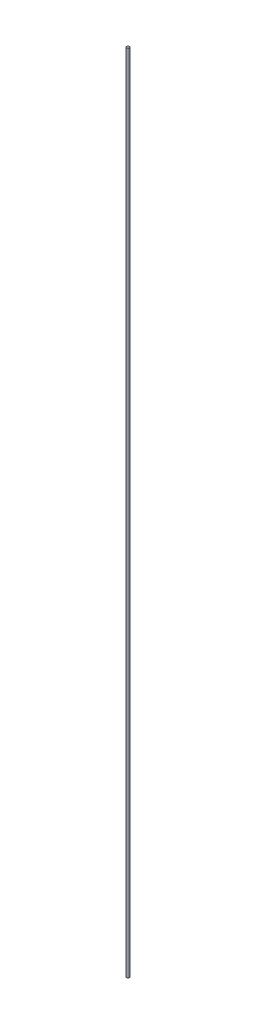
ISO-10303-21;
HEADER;
FILE_DESCRIPTION(('STEP AP214'),'2;1');
FILE_NAME('part.step','',(''),(''),'','','');
FILE_SCHEMA(('AUTOMOTIVE_DESIGN { 1 0 10303 214 1 1 1 1 }'));
ENDSEC;
DATA;
#1=APPLICATION_CONTEXT('core data for automotive mechanical design processes');
#2=APPLICATION_PROTOCOL_DEFINITION('international standard','automotive_design',2000,#1);
#3=PRODUCT_CONTEXT('',#1,'mechanical');
#4=PRODUCT('Part','Part','',(#3));
#5=PRODUCT_RELATED_PRODUCT_CATEGORY('part','',(#4));
#6=PRODUCT_DEFINITION_FORMATION('','',#4);
#7=PRODUCT_DEFINITION_CONTEXT('part definition',#1,'design');
#8=PRODUCT_DEFINITION('design','',#6,#7);
#9=PRODUCT_DEFINITION_SHAPE('','',#8);
#10=(LENGTH_UNIT() NAMED_UNIT(*) SI_UNIT(.MILLI.,.METRE.));
#11=(NAMED_UNIT(*) PLANE_ANGLE_UNIT() SI_UNIT($,.RADIAN.));
#12=(NAMED_UNIT(*) SI_UNIT($,.STERADIAN.) SOLID_ANGLE_UNIT());
#13=UNCERTAINTY_MEASURE_WITH_UNIT(LENGTH_MEASURE(1.E-05),#10,'distance_accuracy_value','');
#14=(GEOMETRIC_REPRESENTATION_CONTEXT(3) GLOBAL_UNCERTAINTY_ASSIGNED_CONTEXT((#13)) GLOBAL_UNIT_ASSIGNED_CONTEXT((#10,
#11,#12)) REPRESENTATION_CONTEXT('',''));
#15=CARTESIAN_POINT('',(0.,0.,0.));
#16=DIRECTION('',(0.,0.,1.));
#17=DIRECTION('',(1.,0.,0.));
#18=AXIS2_PLACEMENT_3D('',#15,#16,#17);
#19=CARTESIAN_POINT('',(0.,600.,0.));
#20=DIRECTION('',(0.,-1.,0.));
#21=DIRECTION('',(0.,0.,-1.));
#22=AXIS2_PLACEMENT_3D('',#19,#20,#21);
#23=CYLINDRICAL_SURFACE('',#22,1.);
#24=CARTESIAN_POINT('',(0.,600.,0.));
#25=DIRECTION('',(0.,1.,0.));
#26=DIRECTION('',(0.,0.,1.));
#27=AXIS2_PLACEMENT_3D('',#24,#25,#26);
#28=CIRCLE('',#27,1.);
#29=CARTESIAN_POINT('',(0.,600.,1.));
#30=VERTEX_POINT('',#29);
#31=EDGE_CURVE('E10',#30,#30,#28,.T.);
#32=ORIENTED_EDGE('',*,*,#31,.F.);
#33=EDGE_LOOP('',(#32));
#34=FACE_BOUND('',#33,.T.);
#35=CARTESIAN_POINT('',(0.,0.,0.));
#36=DIRECTION('',(0.,1.,0.));
#37=DIRECTION('',(0.,0.,1.));
#38=AXIS2_PLACEMENT_3D('',#35,#36,#37);
#39=CIRCLE('',#38,1.);
#40=CARTESIAN_POINT('',(0.,0.,1.));
#41=VERTEX_POINT('',#40);
#42=EDGE_CURVE('E35',#41,#41,#39,.T.);
#43=ORIENTED_EDGE('',*,*,#42,.T.);
#44=EDGE_LOOP('',(#43));
#45=FACE_BOUND('',#44,.T.);
#46=ADVANCED_FACE('F32',(#34,#45),#23,.T.);
#47=CARTESIAN_POINT('',(0.,600.,0.));
#48=DIRECTION('',(0.,1.,0.));
#49=DIRECTION('',(0.,0.,1.));
#50=AXIS2_PLACEMENT_3D('',#47,#48,#49);
#51=PLANE('',#50);
#52=ORIENTED_EDGE('',*,*,#31,.T.);
#53=EDGE_LOOP('',(#52));
#54=FACE_BOUND('',#53,.T.);
#55=ADVANCED_FACE('F47',(#54),#51,.T.);
#56=CARTESIAN_POINT('',(0.,0.,0.));
#57=DIRECTION('',(0.,1.,0.));
#58=DIRECTION('',(0.,0.,1.));
#59=AXIS2_PLACEMENT_3D('',#56,#57,#58);
#60=PLANE('',#59);
#61=ORIENTED_EDGE('',*,*,#42,.F.);
#62=EDGE_LOOP('',(#61));
#63=FACE_BOUND('',#62,.T.);
#64=ADVANCED_FACE('F45',(#63),#60,.F.);
#65=CLOSED_SHELL('',(#46,#55,#64));
#66=MANIFOLD_SOLID_BREP('B2',#65);
#67=ADVANCED_BREP_SHAPE_REPRESENTATION('',(#18,#66),#14);
#68=SHAPE_DEFINITION_REPRESENTATION(#9,#67);
ENDSEC;
END-ISO-10303-21;
